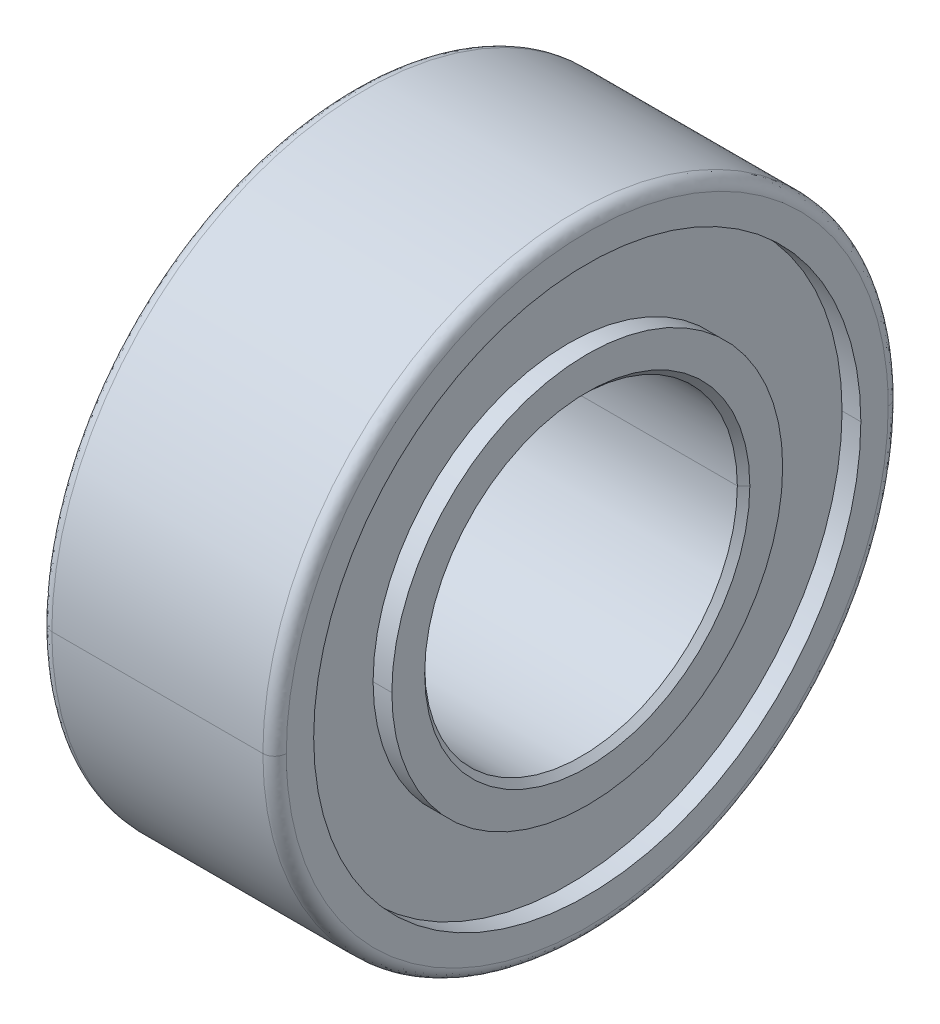
ISO-10303-21;
HEADER;
FILE_DESCRIPTION(('STEP AP214'),'2;1');
FILE_NAME('part.step','',(''),(''),'','','');
FILE_SCHEMA(('AUTOMOTIVE_DESIGN { 1 0 10303 214 1 1 1 1 }'));
ENDSEC;
DATA;
#1=APPLICATION_CONTEXT('core data for automotive mechanical design processes');
#2=APPLICATION_PROTOCOL_DEFINITION('international standard','automotive_design',2000,#1);
#3=PRODUCT_CONTEXT('',#1,'mechanical');
#4=PRODUCT('Part','Part','',(#3));
#5=PRODUCT_RELATED_PRODUCT_CATEGORY('part','',(#4));
#6=PRODUCT_DEFINITION_FORMATION('','',#4);
#7=PRODUCT_DEFINITION_CONTEXT('part definition',#1,'design');
#8=PRODUCT_DEFINITION('design','',#6,#7);
#9=PRODUCT_DEFINITION_SHAPE('','',#8);
#10=(LENGTH_UNIT() NAMED_UNIT(*) SI_UNIT(.MILLI.,.METRE.));
#11=(NAMED_UNIT(*) PLANE_ANGLE_UNIT() SI_UNIT($,.RADIAN.));
#12=(NAMED_UNIT(*) SI_UNIT($,.STERADIAN.) SOLID_ANGLE_UNIT());
#13=UNCERTAINTY_MEASURE_WITH_UNIT(LENGTH_MEASURE(1.E-05),#10,'distance_accuracy_value','');
#14=(GEOMETRIC_REPRESENTATION_CONTEXT(3) GLOBAL_UNCERTAINTY_ASSIGNED_CONTEXT((#13)) GLOBAL_UNIT_ASSIGNED_CONTEXT((#10,
#11,#12)) REPRESENTATION_CONTEXT('',''));
#15=CARTESIAN_POINT('',(0.,0.,0.));
#16=DIRECTION('',(0.,0.,1.));
#17=DIRECTION('',(1.,0.,0.));
#18=AXIS2_PLACEMENT_3D('',#15,#16,#17);
#19=CARTESIAN_POINT('',(0.,0.,0.));
#20=DIRECTION('',(-1.,0.,0.));
#21=DIRECTION('',(0.,0.,1.));
#22=AXIS2_PLACEMENT_3D('',#19,#20,#21);
#23=CYLINDRICAL_SURFACE('',#22,3.175);
#24=DIRECTION('',(-1.,0.,0.));
#25=VECTOR('',#24,1.);
#26=CARTESIAN_POINT('',(0.,0.,-3.175));
#27=LINE('',#26,#25);
#28=CARTESIAN_POINT('',(2.25425000002133,0.,-3.17500000005566));
#29=VERTEX_POINT('',#28);
#30=CARTESIAN_POINT('',(-2.25424999996448,0.,-3.17499999999881));
#31=VERTEX_POINT('',#30);
#32=EDGE_CURVE('E327',#29,#31,#27,.T.);
#33=ORIENTED_EDGE('',*,*,#32,.F.);
#34=CARTESIAN_POINT('',(2.25425000002133,0.,0.));
#35=DIRECTION('',(1.,0.,0.));
#36=DIRECTION('',(0.,0.,-1.));
#37=AXIS2_PLACEMENT_3D('',#34,#35,#36);
#38=CIRCLE('',#37,3.17500000005566);
#39=CARTESIAN_POINT('',(2.25425000002133,0.,3.17500000005566));
#40=VERTEX_POINT('',#39);
#41=EDGE_CURVE('E11',#29,#40,#38,.T.);
#42=ORIENTED_EDGE('',*,*,#41,.T.);
#43=DIRECTION('',(-1.,0.,0.));
#44=VECTOR('',#43,1.);
#45=CARTESIAN_POINT('',(0.,0.,3.175));
#46=LINE('',#45,#44);
#47=CARTESIAN_POINT('',(-2.25424999996448,0.,3.17499999999881));
#48=VERTEX_POINT('',#47);
#49=EDGE_CURVE('E277',#40,#48,#46,.T.);
#50=ORIENTED_EDGE('',*,*,#49,.T.);
#51=CARTESIAN_POINT('',(-2.25424999996448,0.,0.));
#52=DIRECTION('',(-1.,0.,0.));
#53=DIRECTION('',(0.,0.,1.));
#54=AXIS2_PLACEMENT_3D('',#51,#52,#53);
#55=CIRCLE('',#54,3.17499999999881);
#56=EDGE_CURVE('E27',#48,#31,#55,.T.);
#57=ORIENTED_EDGE('',*,*,#56,.T.);
#58=EDGE_LOOP('',(#33,#42,#50,#57));
#59=FACE_BOUND('',#58,.T.);
#60=ADVANCED_FACE('F16',(#59),#23,.F.);
#61=CARTESIAN_POINT('',(2.38125000004174,0.,0.));
#62=DIRECTION('',(1.,0.,0.));
#63=DIRECTION('',(0.,0.,-1.));
#64=AXIS2_PLACEMENT_3D('',#61,#62,#63);
#65=CONICAL_SURFACE('',#64,3.30200000001923,0.785398163173655);
#66=DIRECTION('',(0.707106781344793,0.,0.707106781028302));
#67=VECTOR('',#66,1.);
#68=CARTESIAN_POINT('',(2.38125000004174,0.,3.30200000001923));
#69=LINE('',#68,#67);
#70=CARTESIAN_POINT('',(2.38125000004174,0.,3.30200000001923));
#71=VERTEX_POINT('',#70);
#72=EDGE_CURVE('E322',#40,#71,#69,.T.);
#73=ORIENTED_EDGE('',*,*,#72,.F.);
#74=ORIENTED_EDGE('',*,*,#41,.F.);
#75=DIRECTION('',(0.707106781344793,0.,-0.707106781028302));
#76=VECTOR('',#75,1.);
#77=CARTESIAN_POINT('',(2.38125000004174,0.,-3.30200000001923));
#78=LINE('',#77,#76);
#79=CARTESIAN_POINT('',(2.38125000004174,0.,-3.30200000001923));
#80=VERTEX_POINT('',#79);
#81=EDGE_CURVE('E331',#29,#80,#78,.T.);
#82=ORIENTED_EDGE('',*,*,#81,.T.);
#83=CARTESIAN_POINT('',(2.38125000004174,0.,0.));
#84=DIRECTION('',(1.,0.,0.));
#85=DIRECTION('',(0.,0.,-1.));
#86=AXIS2_PLACEMENT_3D('',#83,#84,#85);
#87=CIRCLE('',#86,3.30200000001923);
#88=EDGE_CURVE('E41',#80,#71,#87,.T.);
#89=ORIENTED_EDGE('',*,*,#88,.T.);
#90=EDGE_LOOP('',(#73,#74,#82,#89));
#91=FACE_BOUND('',#90,.T.);
#92=ADVANCED_FACE('F586',(#91),#65,.F.);
#93=CARTESIAN_POINT('',(-2.38124999992806,0.,0.));
#94=DIRECTION('',(-1.,0.,0.));
#95=DIRECTION('',(0.,0.,1.));
#96=AXIS2_PLACEMENT_3D('',#93,#94,#95);
#97=CONICAL_SURFACE('',#96,3.30199999990554,0.785398163397448);
#98=DIRECTION('',(-0.707106781186548,0.,-0.707106781186548));
#99=VECTOR('',#98,1.);
#100=CARTESIAN_POINT('',(-2.38124999992806,0.,-3.30199999990554));
#101=LINE('',#100,#99);
#102=CARTESIAN_POINT('',(-2.3812499999849,0.,-3.30199999996239));
#103=VERTEX_POINT('',#102);
#104=EDGE_CURVE('E252',#31,#103,#101,.T.);
#105=ORIENTED_EDGE('',*,*,#104,.F.);
#106=ORIENTED_EDGE('',*,*,#56,.F.);
#107=DIRECTION('',(-0.707106781186548,0.,0.707106781186548));
#108=VECTOR('',#107,1.);
#109=CARTESIAN_POINT('',(-2.38124999992806,0.,3.30199999990554));
#110=LINE('',#109,#108);
#111=CARTESIAN_POINT('',(-2.3812499999849,0.,3.30199999996239));
#112=VERTEX_POINT('',#111);
#113=EDGE_CURVE('E287',#48,#112,#110,.T.);
#114=ORIENTED_EDGE('',*,*,#113,.T.);
#115=CARTESIAN_POINT('',(-2.3812499999849,0.,0.));
#116=DIRECTION('',(-1.,0.,0.));
#117=DIRECTION('',(0.,0.,1.));
#118=AXIS2_PLACEMENT_3D('',#115,#116,#117);
#119=CIRCLE('',#118,3.30199999996239);
#120=EDGE_CURVE('E308',#112,#103,#119,.T.);
#121=ORIENTED_EDGE('',*,*,#120,.T.);
#122=EDGE_LOOP('',(#105,#106,#114,#121));
#123=FACE_BOUND('',#122,.T.);
#124=ADVANCED_FACE('F401',(#123),#97,.F.);
#125=CARTESIAN_POINT('',(2.38125,3.175,0.));
#126=DIRECTION('',(-1.,0.,0.));
#127=DIRECTION('',(0.,0.,1.));
#128=AXIS2_PLACEMENT_3D('',#125,#126,#127);
#129=PLANE('',#128);
#130=ORIENTED_EDGE('',*,*,#88,.F.);
#131=CARTESIAN_POINT('',(2.38125000004174,0.,0.));
#132=DIRECTION('',(1.,0.,0.));
#133=DIRECTION('',(0.,0.,-1.));
#134=AXIS2_PLACEMENT_3D('',#131,#132,#133);
#135=CIRCLE('',#134,3.30200000001923);
#136=EDGE_CURVE('E326',#71,#80,#135,.T.);
#137=ORIENTED_EDGE('',*,*,#136,.F.);
#138=EDGE_LOOP('',(#130,#137));
#139=FACE_BOUND('',#138,.T.);
#140=CARTESIAN_POINT('',(2.38125,0.,0.));
#141=DIRECTION('',(-1.,0.,0.));
#142=DIRECTION('',(0.,0.,1.));
#143=AXIS2_PLACEMENT_3D('',#140,#141,#142);
#144=CIRCLE('',#143,3.96875);
#145=CARTESIAN_POINT('',(2.38125,0.,3.96875));
#146=VERTEX_POINT('',#145);
#147=CARTESIAN_POINT('',(2.38125,0.,-3.96875));
#148=VERTEX_POINT('',#147);
#149=EDGE_CURVE('E315',#146,#148,#144,.T.);
#150=ORIENTED_EDGE('',*,*,#149,.F.);
#151=CARTESIAN_POINT('',(2.38125,0.,0.));
#152=DIRECTION('',(-1.,0.,0.));
#153=DIRECTION('',(0.,0.,1.));
#154=AXIS2_PLACEMENT_3D('',#151,#152,#153);
#155=CIRCLE('',#154,3.96875);
#156=EDGE_CURVE('E238',#148,#146,#155,.T.);
#157=ORIENTED_EDGE('',*,*,#156,.F.);
#158=EDGE_LOOP('',(#150,#157));
#159=FACE_BOUND('',#158,.T.);
#160=ADVANCED_FACE('F398',(#139,#159),#129,.F.);
#161=CARTESIAN_POINT('',(-2.38125,3.96875,0.));
#162=DIRECTION('',(1.,0.,0.));
#163=DIRECTION('',(0.,1.,0.));
#164=AXIS2_PLACEMENT_3D('',#161,#162,#163);
#165=PLANE('',#164);
#166=ORIENTED_EDGE('',*,*,#120,.F.);
#167=CARTESIAN_POINT('',(-2.3812499999849,0.,0.));
#168=DIRECTION('',(-1.,0.,0.));
#169=DIRECTION('',(0.,0.,1.));
#170=AXIS2_PLACEMENT_3D('',#167,#168,#169);
#171=CIRCLE('',#170,3.30199999996239);
#172=EDGE_CURVE('E256',#103,#112,#171,.T.);
#173=ORIENTED_EDGE('',*,*,#172,.F.);
#174=EDGE_LOOP('',(#166,#173));
#175=FACE_BOUND('',#174,.T.);
#176=CARTESIAN_POINT('',(-2.38125,0.,0.));
#177=DIRECTION('',(1.,0.,0.));
#178=DIRECTION('',(0.,0.,1.));
#179=AXIS2_PLACEMENT_3D('',#176,#177,#178);
#180=CIRCLE('',#179,3.96875);
#181=CARTESIAN_POINT('',(-2.38125,0.,3.96875));
#182=VERTEX_POINT('',#181);
#183=CARTESIAN_POINT('',(-2.38125,0.,-3.96875));
#184=VERTEX_POINT('',#183);
#185=EDGE_CURVE('E227',#182,#184,#180,.T.);
#186=ORIENTED_EDGE('',*,*,#185,.F.);
#187=CARTESIAN_POINT('',(-2.38125,0.,0.));
#188=DIRECTION('',(1.,0.,0.));
#189=DIRECTION('',(0.,0.,1.));
#190=AXIS2_PLACEMENT_3D('',#187,#188,#189);
#191=CIRCLE('',#190,3.96875);
#192=EDGE_CURVE('E335',#184,#182,#191,.T.);
#193=ORIENTED_EDGE('',*,*,#192,.F.);
#194=EDGE_LOOP('',(#186,#193));
#195=FACE_BOUND('',#194,.T.);
#196=ADVANCED_FACE('F18',(#175,#195),#165,.F.);
#197=CARTESIAN_POINT('',(0.,0.,0.));
#198=DIRECTION('',(-1.,0.,0.));
#199=DIRECTION('',(0.,0.,1.));
#200=AXIS2_PLACEMENT_3D('',#197,#198,#199);
#201=CYLINDRICAL_SURFACE('',#200,3.96875);
#202=DIRECTION('',(-1.,0.,0.));
#203=VECTOR('',#202,1.);
#204=CARTESIAN_POINT('',(0.,0.,-3.96875));
#205=LINE('',#204,#203);
#206=CARTESIAN_POINT('',(2.00025,0.,-3.96875));
#207=VERTEX_POINT('',#206);
#208=EDGE_CURVE('E268',#148,#207,#205,.T.);
#209=ORIENTED_EDGE('',*,*,#208,.F.);
#210=ORIENTED_EDGE('',*,*,#156,.T.);
#211=DIRECTION('',(-1.,0.,0.));
#212=VECTOR('',#211,1.);
#213=CARTESIAN_POINT('',(0.,0.,3.96875));
#214=LINE('',#213,#212);
#215=CARTESIAN_POINT('',(2.00025,0.,3.96875));
#216=VERTEX_POINT('',#215);
#217=EDGE_CURVE('E267',#146,#216,#214,.T.);
#218=ORIENTED_EDGE('',*,*,#217,.T.);
#219=CARTESIAN_POINT('',(2.00025,0.,0.));
#220=DIRECTION('',(1.,0.,0.));
#221=DIRECTION('',(0.,0.,1.));
#222=AXIS2_PLACEMENT_3D('',#219,#220,#221);
#223=CIRCLE('',#222,3.96875);
#224=EDGE_CURVE('E224',#216,#207,#223,.T.);
#225=ORIENTED_EDGE('',*,*,#224,.T.);
#226=EDGE_LOOP('',(#209,#210,#218,#225));
#227=FACE_BOUND('',#226,.T.);
#228=ADVANCED_FACE('F406',(#227),#201,.T.);
#229=CARTESIAN_POINT('',(0.,0.,0.));
#230=DIRECTION('',(-1.,0.,0.));
#231=DIRECTION('',(0.,0.,1.));
#232=AXIS2_PLACEMENT_3D('',#229,#230,#231);
#233=CYLINDRICAL_SURFACE('',#232,3.96875);
#234=DIRECTION('',(-1.,0.,0.));
#235=VECTOR('',#234,1.);
#236=CARTESIAN_POINT('',(0.,0.,-3.96875));
#237=LINE('',#236,#235);
#238=CARTESIAN_POINT('',(-2.00025,0.,-3.96875));
#239=VERTEX_POINT('',#238);
#240=EDGE_CURVE('E215',#239,#184,#237,.T.);
#241=ORIENTED_EDGE('',*,*,#240,.F.);
#242=CARTESIAN_POINT('',(-2.00025,0.,0.));
#243=DIRECTION('',(-1.,0.,0.));
#244=DIRECTION('',(0.,0.,1.));
#245=AXIS2_PLACEMENT_3D('',#242,#243,#244);
#246=CIRCLE('',#245,3.96875);
#247=CARTESIAN_POINT('',(-2.00025,0.,3.96875));
#248=VERTEX_POINT('',#247);
#249=EDGE_CURVE('E228',#239,#248,#246,.T.);
#250=ORIENTED_EDGE('',*,*,#249,.T.);
#251=DIRECTION('',(-1.,0.,0.));
#252=VECTOR('',#251,1.);
#253=CARTESIAN_POINT('',(0.,0.,3.96875));
#254=LINE('',#253,#252);
#255=EDGE_CURVE('E338',#248,#182,#254,.T.);
#256=ORIENTED_EDGE('',*,*,#255,.T.);
#257=ORIENTED_EDGE('',*,*,#185,.T.);
#258=EDGE_LOOP('',(#241,#250,#256,#257));
#259=FACE_BOUND('',#258,.T.);
#260=ADVANCED_FACE('F475',(#259),#233,.T.);
#261=CARTESIAN_POINT('',(2.00025,3.96875,0.));
#262=DIRECTION('',(-1.,0.,0.));
#263=DIRECTION('',(0.,0.,1.));
#264=AXIS2_PLACEMENT_3D('',#261,#262,#263);
#265=PLANE('',#264);
#266=ORIENTED_EDGE('',*,*,#224,.F.);
#267=CARTESIAN_POINT('',(2.00025,0.,0.));
#268=DIRECTION('',(1.,0.,0.));
#269=DIRECTION('',(0.,0.,1.));
#270=AXIS2_PLACEMENT_3D('',#267,#268,#269);
#271=CIRCLE('',#270,3.96875);
#272=EDGE_CURVE('E263',#207,#216,#271,.T.);
#273=ORIENTED_EDGE('',*,*,#272,.F.);
#274=EDGE_LOOP('',(#266,#273));
#275=FACE_BOUND('',#274,.T.);
#276=CARTESIAN_POINT('',(2.00025,0.,0.));
#277=DIRECTION('',(1.,0.,0.));
#278=DIRECTION('',(0.,0.,1.));
#279=AXIS2_PLACEMENT_3D('',#276,#277,#278);
#280=CIRCLE('',#279,5.55625);
#281=CARTESIAN_POINT('',(2.00025,0.,5.55625));
#282=VERTEX_POINT('',#281);
#283=CARTESIAN_POINT('',(2.00025,0.,-5.55625));
#284=VERTEX_POINT('',#283);
#285=EDGE_CURVE('E221',#282,#284,#280,.T.);
#286=ORIENTED_EDGE('',*,*,#285,.T.);
#287=CARTESIAN_POINT('',(2.00025,0.,0.));
#288=DIRECTION('',(1.,0.,0.));
#289=DIRECTION('',(0.,0.,1.));
#290=AXIS2_PLACEMENT_3D('',#287,#288,#289);
#291=CIRCLE('',#290,5.55625);
#292=EDGE_CURVE('E176',#284,#282,#291,.T.);
#293=ORIENTED_EDGE('',*,*,#292,.T.);
#294=EDGE_LOOP('',(#286,#293));
#295=FACE_BOUND('',#294,.T.);
#296=ADVANCED_FACE('F470',(#275,#295),#265,.F.);
#297=CARTESIAN_POINT('',(-2.00025,5.55625,0.));
#298=DIRECTION('',(1.,0.,0.));
#299=DIRECTION('',(0.,1.,0.));
#300=AXIS2_PLACEMENT_3D('',#297,#298,#299);
#301=PLANE('',#300);
#302=CARTESIAN_POINT('',(-2.00025,0.,0.));
#303=DIRECTION('',(-1.,0.,0.));
#304=DIRECTION('',(0.,0.,1.));
#305=AXIS2_PLACEMENT_3D('',#302,#303,#304);
#306=CIRCLE('',#305,3.96875);
#307=EDGE_CURVE('E208',#248,#239,#306,.T.);
#308=ORIENTED_EDGE('',*,*,#307,.F.);
#309=ORIENTED_EDGE('',*,*,#249,.F.);
#310=EDGE_LOOP('',(#308,#309));
#311=FACE_BOUND('',#310,.T.);
#312=CARTESIAN_POINT('',(-2.00025,0.,0.));
#313=DIRECTION('',(-1.,0.,0.));
#314=DIRECTION('',(0.,0.,1.));
#315=AXIS2_PLACEMENT_3D('',#312,#313,#314);
#316=CIRCLE('',#315,5.55625);
#317=CARTESIAN_POINT('',(-2.00025,0.,5.55625));
#318=VERTEX_POINT('',#317);
#319=CARTESIAN_POINT('',(-2.00025,0.,-5.55625));
#320=VERTEX_POINT('',#319);
#321=EDGE_CURVE('E165',#318,#320,#316,.T.);
#322=ORIENTED_EDGE('',*,*,#321,.T.);
#323=CARTESIAN_POINT('',(-2.00025,0.,0.));
#324=DIRECTION('',(-1.,0.,0.));
#325=DIRECTION('',(0.,0.,1.));
#326=AXIS2_PLACEMENT_3D('',#323,#324,#325);
#327=CIRCLE('',#326,5.55625);
#328=EDGE_CURVE('E180',#320,#318,#327,.T.);
#329=ORIENTED_EDGE('',*,*,#328,.T.);
#330=EDGE_LOOP('',(#322,#329));
#331=FACE_BOUND('',#330,.T.);
#332=ADVANCED_FACE('F185',(#311,#331),#301,.F.);
#333=CARTESIAN_POINT('',(0.,0.,0.));
#334=DIRECTION('',(-1.,0.,0.));
#335=DIRECTION('',(0.,0.,1.));
#336=AXIS2_PLACEMENT_3D('',#333,#334,#335);
#337=CYLINDRICAL_SURFACE('',#336,5.55625);
#338=DIRECTION('',(-1.,0.,0.));
#339=VECTOR('',#338,1.);
#340=CARTESIAN_POINT('',(0.,0.,-5.55625));
#341=LINE('',#340,#339);
#342=CARTESIAN_POINT('',(2.38125,0.,-5.55625));
#343=VERTEX_POINT('',#342);
#344=EDGE_CURVE('E217',#343,#284,#341,.T.);
#345=ORIENTED_EDGE('',*,*,#344,.F.);
#346=CARTESIAN_POINT('',(2.38125,0.,0.));
#347=DIRECTION('',(1.,0.,0.));
#348=DIRECTION('',(0.,0.,1.));
#349=AXIS2_PLACEMENT_3D('',#346,#347,#348);
#350=CIRCLE('',#349,5.55625);
#351=CARTESIAN_POINT('',(2.38125,0.,5.55625));
#352=VERTEX_POINT('',#351);
#353=EDGE_CURVE('E130',#343,#352,#350,.T.);
#354=ORIENTED_EDGE('',*,*,#353,.T.);
#355=DIRECTION('',(-1.,0.,0.));
#356=VECTOR('',#355,1.);
#357=CARTESIAN_POINT('',(0.,0.,5.55625));
#358=LINE('',#357,#356);
#359=EDGE_CURVE('E216',#352,#282,#358,.T.);
#360=ORIENTED_EDGE('',*,*,#359,.T.);
#361=ORIENTED_EDGE('',*,*,#292,.F.);
#362=EDGE_LOOP('',(#345,#354,#360,#361));
#363=FACE_BOUND('',#362,.T.);
#364=ADVANCED_FACE('F508',(#363),#337,.F.);
#365=CARTESIAN_POINT('',(0.,0.,0.));
#366=DIRECTION('',(-1.,0.,0.));
#367=DIRECTION('',(0.,0.,1.));
#368=AXIS2_PLACEMENT_3D('',#365,#366,#367);
#369=CYLINDRICAL_SURFACE('',#368,5.55625);
#370=DIRECTION('',(-1.,0.,0.));
#371=VECTOR('',#370,1.);
#372=CARTESIAN_POINT('',(0.,0.,-5.55625));
#373=LINE('',#372,#371);
#374=CARTESIAN_POINT('',(-2.38125,0.,-5.55625));
#375=VERTEX_POINT('',#374);
#376=EDGE_CURVE('E171',#320,#375,#373,.T.);
#377=ORIENTED_EDGE('',*,*,#376,.F.);
#378=ORIENTED_EDGE('',*,*,#321,.F.);
#379=DIRECTION('',(-1.,0.,0.));
#380=VECTOR('',#379,1.);
#381=CARTESIAN_POINT('',(0.,0.,5.55625));
#382=LINE('',#381,#380);
#383=CARTESIAN_POINT('',(-2.38125,0.,5.55625));
#384=VERTEX_POINT('',#383);
#385=EDGE_CURVE('E168',#318,#384,#382,.T.);
#386=ORIENTED_EDGE('',*,*,#385,.T.);
#387=CARTESIAN_POINT('',(-2.38125,0.,0.));
#388=DIRECTION('',(-1.,0.,0.));
#389=DIRECTION('',(0.,0.,1.));
#390=AXIS2_PLACEMENT_3D('',#387,#388,#389);
#391=CIRCLE('',#390,5.55625);
#392=EDGE_CURVE('E117',#384,#375,#391,.T.);
#393=ORIENTED_EDGE('',*,*,#392,.T.);
#394=EDGE_LOOP('',(#377,#378,#386,#393));
#395=FACE_BOUND('',#394,.T.);
#396=ADVANCED_FACE('F167',(#395),#369,.F.);
#397=CARTESIAN_POINT('',(2.38125,5.55625,0.));
#398=DIRECTION('',(-1.,0.,0.));
#399=DIRECTION('',(0.,0.,1.));
#400=AXIS2_PLACEMENT_3D('',#397,#398,#399);
#401=PLANE('',#400);
#402=CARTESIAN_POINT('',(2.38125,0.,0.));
#403=DIRECTION('',(1.,0.,0.));
#404=DIRECTION('',(0.,0.,1.));
#405=AXIS2_PLACEMENT_3D('',#402,#403,#404);
#406=CIRCLE('',#405,5.55625);
#407=EDGE_CURVE('E183',#352,#343,#406,.T.);
#408=ORIENTED_EDGE('',*,*,#407,.F.);
#409=ORIENTED_EDGE('',*,*,#353,.F.);
#410=EDGE_LOOP('',(#408,#409));
#411=FACE_BOUND('',#410,.T.);
#412=CARTESIAN_POINT('',(2.38125,0.,6.111875));
#413=CARTESIAN_POINT('',(2.38125,12.22375,6.11187499999999));
#414=CARTESIAN_POINT('',(2.38125,12.22375,-6.11187499999999));
#415=CARTESIAN_POINT('',(2.38125,0.,-6.111875));
#416=(BOUNDED_CURVE() B_SPLINE_CURVE(3,(#412,#413,#414,#415),.UNSPECIFIED.,.F.,
.F.) B_SPLINE_CURVE_WITH_KNOTS((4,4),(0.,1.),
.UNSPECIFIED.) CURVE() GEOMETRIC_REPRESENTATION_ITEM() RATIONAL_B_SPLINE_CURVE((1.,
0.333333333333334,0.333333333333334,1.)) REPRESENTATION_ITEM(''));
#417=CARTESIAN_POINT('',(2.38125,0.,6.111875));
#418=VERTEX_POINT('',#417);
#419=CARTESIAN_POINT('',(2.38125,0.,-6.111875));
#420=VERTEX_POINT('',#419);
#421=EDGE_CURVE('E89',#418,#420,#416,.T.);
#422=ORIENTED_EDGE('',*,*,#421,.F.);
#423=CARTESIAN_POINT('',(2.38125,0.,-6.111875));
#424=CARTESIAN_POINT('',(2.38125,-12.22375,-6.11187499999999));
#425=CARTESIAN_POINT('',(2.38125,-12.22375,6.11187499999999));
#426=CARTESIAN_POINT('',(2.38125,0.,6.111875));
#427=(BOUNDED_CURVE() B_SPLINE_CURVE(3,(#423,#424,#425,#426),.UNSPECIFIED.,.F.,
.F.) B_SPLINE_CURVE_WITH_KNOTS((4,4),(0.,1.),
.UNSPECIFIED.) CURVE() GEOMETRIC_REPRESENTATION_ITEM() RATIONAL_B_SPLINE_CURVE((1.,
0.333333333333334,0.333333333333334,1.)) REPRESENTATION_ITEM(''));
#428=EDGE_CURVE('E262',#420,#418,#427,.T.);
#429=ORIENTED_EDGE('',*,*,#428,.F.);
#430=EDGE_LOOP('',(#422,#429));
#431=FACE_BOUND('',#430,.T.);
#432=ADVANCED_FACE('F484',(#411,#431),#401,.F.);
#433=CARTESIAN_POINT('',(-2.38125,6.35,0.));
#434=DIRECTION('',(1.,0.,0.));
#435=DIRECTION('',(0.,1.,0.));
#436=AXIS2_PLACEMENT_3D('',#433,#434,#435);
#437=PLANE('',#436);
#438=ORIENTED_EDGE('',*,*,#392,.F.);
#439=CARTESIAN_POINT('',(-2.38125,0.,0.));
#440=DIRECTION('',(-1.,0.,0.));
#441=DIRECTION('',(0.,0.,1.));
#442=AXIS2_PLACEMENT_3D('',#439,#440,#441);
#443=CIRCLE('',#442,5.55625);
#444=EDGE_CURVE('E181',#375,#384,#443,.T.);
#445=ORIENTED_EDGE('',*,*,#444,.F.);
#446=EDGE_LOOP('',(#438,#445));
#447=FACE_BOUND('',#446,.T.);
#448=CARTESIAN_POINT('',(-2.38125,0.,-6.111875));
#449=CARTESIAN_POINT('',(-2.38125,12.22375,-6.11187499999999));
#450=CARTESIAN_POINT('',(-2.38125,12.22375,6.11187499999999));
#451=CARTESIAN_POINT('',(-2.38125,0.,6.111875));
#452=(BOUNDED_CURVE() B_SPLINE_CURVE(3,(#448,#449,#450,#451),.UNSPECIFIED.,.F.,
.F.) B_SPLINE_CURVE_WITH_KNOTS((4,4),(0.,1.),
.UNSPECIFIED.) CURVE() GEOMETRIC_REPRESENTATION_ITEM() RATIONAL_B_SPLINE_CURVE((1.,
0.333333333333334,0.333333333333334,1.)) REPRESENTATION_ITEM(''));
#453=CARTESIAN_POINT('',(-2.38125,0.,-6.111875));
#454=VERTEX_POINT('',#453);
#455=CARTESIAN_POINT('',(-2.38125,0.,6.111875));
#456=VERTEX_POINT('',#455);
#457=EDGE_CURVE('E271',#454,#456,#452,.T.);
#458=ORIENTED_EDGE('',*,*,#457,.F.);
#459=CARTESIAN_POINT('',(-2.38125,0.,6.111875));
#460=CARTESIAN_POINT('',(-2.38125,-12.22375,6.11187499999999));
#461=CARTESIAN_POINT('',(-2.38125,-12.22375,-6.11187499999999));
#462=CARTESIAN_POINT('',(-2.38125,0.,-6.111875));
#463=(BOUNDED_CURVE() B_SPLINE_CURVE(3,(#459,#460,#461,#462),.UNSPECIFIED.,.F.,
.F.) B_SPLINE_CURVE_WITH_KNOTS((4,4),(0.,1.),
.UNSPECIFIED.) CURVE() GEOMETRIC_REPRESENTATION_ITEM() RATIONAL_B_SPLINE_CURVE((1.,
0.333333333333334,0.333333333333334,1.)) REPRESENTATION_ITEM(''));
#464=EDGE_CURVE('E200',#456,#454,#463,.T.);
#465=ORIENTED_EDGE('',*,*,#464,.F.);
#466=EDGE_LOOP('',(#458,#465));
#467=FACE_BOUND('',#466,.T.);
#468=ADVANCED_FACE('F489',(#447,#467),#437,.F.);
#469=CARTESIAN_POINT('',(2.143125,0.,6.35));
#470=CARTESIAN_POINT('',(2.143125,12.7,6.34999999999999));
#471=CARTESIAN_POINT('',(2.143125,12.7,-6.34999999999999));
#472=CARTESIAN_POINT('',(2.143125,0.,-6.35));
#473=CARTESIAN_POINT('',(2.28261539545991,0.,6.35));
#474=CARTESIAN_POINT('',(2.28261539545991,12.7,6.34999999999999));
#475=CARTESIAN_POINT('',(2.28261539545991,12.7,-6.34999999999999));
#476=CARTESIAN_POINT('',(2.28261539545991,0.,-6.35));
#477=CARTESIAN_POINT('',(2.38125,0.,6.25136539545991));
#478=CARTESIAN_POINT('',(2.38125,12.5027307909198,6.25136539545991));
#479=CARTESIAN_POINT('',(2.38125,12.5027307909198,-6.25136539545989));
#480=CARTESIAN_POINT('',(2.38125,0.,-6.25136539545991));
#481=CARTESIAN_POINT('',(2.38125,0.,6.111875));
#482=CARTESIAN_POINT('',(2.38125,12.22375,6.11187499999999));
#483=CARTESIAN_POINT('',(2.38125,12.22375,-6.11187499999999));
#484=CARTESIAN_POINT('',(2.38125,0.,-6.111875));
#485=(BOUNDED_SURFACE() B_SPLINE_SURFACE(3,3,((#469,#470,#471,#472),(#473,#474,#475,#476),(#477,
#478,#479,#480),(#481,#482,#483,#484)),.UNSPECIFIED.,.F.,.F.,
.F.) B_SPLINE_SURFACE_WITH_KNOTS((4,4),(4,4),(0.,1.),(0.,1.),
.UNSPECIFIED.) GEOMETRIC_REPRESENTATION_ITEM() RATIONAL_B_SPLINE_SURFACE(((1.,0.333333333333334,
0.333333333333334,1.),(0.804737854124365,0.268245951374788,0.268245951374788,0.804737854124365),
(0.804737854124365,0.268245951374788,0.268245951374788,0.804737854124365),(1.,0.333333333333334,
0.333333333333334,1.))) REPRESENTATION_ITEM('') SURFACE());
#486=CARTESIAN_POINT('',(2.143125,0.,-6.111875));
#487=DIRECTION('',(0.,-1.,0.));
#488=DIRECTION('',(0.,0.,-1.));
#489=AXIS2_PLACEMENT_3D('',#486,#487,#488);
#490=CIRCLE('',#489,0.238125);
#491=CARTESIAN_POINT('',(2.143125,0.,-6.35));
#492=VERTEX_POINT('',#491);
#493=EDGE_CURVE('E286',#492,#420,#490,.T.);
#494=CARTESIAN_POINT('',(2.143125,0.,0.));
#495=DIRECTION('',(-1.,0.,0.));
#496=DIRECTION('',(0.,0.,1.));
#497=AXIS2_PLACEMENT_3D('',#494,#495,#496);
#498=CIRCLE('',#497,6.35);
#499=CARTESIAN_POINT('',(2.143125,0.,6.35));
#500=VERTEX_POINT('',#499);
#501=EDGE_CURVE('E261',#500,#492,#498,.T.);
#502=CARTESIAN_POINT('',(2.143125,0.,6.111875));
#503=DIRECTION('',(0.,1.,0.));
#504=DIRECTION('',(0.,0.,1.));
#505=AXIS2_PLACEMENT_3D('',#502,#503,#504);
#506=CIRCLE('',#505,0.238125);
#507=EDGE_CURVE('E258',#500,#418,#506,.T.);
#508=ORIENTED_EDGE('',*,*,#493,.F.);
#509=ORIENTED_EDGE('',*,*,#501,.F.);
#510=ORIENTED_EDGE('',*,*,#507,.T.);
#511=ORIENTED_EDGE('',*,*,#421,.T.);
#512=EDGE_LOOP('',(#508,#509,#510,#511));
#513=FACE_BOUND('',#512,.T.);
#514=ADVANCED_FACE('F608',(#513),#485,.T.);
#515=CARTESIAN_POINT('',(-2.143125,0.,-6.35));
#516=CARTESIAN_POINT('',(-2.143125,12.7,-6.34999999999999));
#517=CARTESIAN_POINT('',(-2.143125,12.7,6.34999999999999));
#518=CARTESIAN_POINT('',(-2.143125,0.,6.35));
#519=CARTESIAN_POINT('',(-2.2826153954599,0.,-6.35));
#520=CARTESIAN_POINT('',(-2.2826153954599,12.7,-6.34999999999999));
#521=CARTESIAN_POINT('',(-2.2826153954599,12.7,6.34999999999999));
#522=CARTESIAN_POINT('',(-2.2826153954599,0.,6.35));
#523=CARTESIAN_POINT('',(-2.38124999999999,0.,-6.25136539545991));
#524=CARTESIAN_POINT('',(-2.38125,12.5027307909198,-6.25136539545991));
#525=CARTESIAN_POINT('',(-2.38125,12.5027307909198,6.25136539545989));
#526=CARTESIAN_POINT('',(-2.38124999999999,0.,6.25136539545991));
#527=CARTESIAN_POINT('',(-2.38125,0.,-6.111875));
#528=CARTESIAN_POINT('',(-2.38125,12.22375,-6.11187499999999));
#529=CARTESIAN_POINT('',(-2.38125,12.22375,6.11187499999999));
#530=CARTESIAN_POINT('',(-2.38125,0.,6.111875));
#531=(BOUNDED_SURFACE() B_SPLINE_SURFACE(3,3,((#515,#516,#517,#518),(#519,#520,#521,#522),(#523,
#524,#525,#526),(#527,#528,#529,#530)),.UNSPECIFIED.,.F.,.F.,
.F.) B_SPLINE_SURFACE_WITH_KNOTS((4,4),(4,4),(0.,1.),(0.,1.),
.UNSPECIFIED.) GEOMETRIC_REPRESENTATION_ITEM() RATIONAL_B_SPLINE_SURFACE(((1.,0.333333333333334,
0.333333333333334,1.),(0.804737854124365,0.268245951374788,0.268245951374788,0.804737854124365),
(0.804737854124365,0.268245951374788,0.268245951374788,0.804737854124365),(1.,0.333333333333334,
0.333333333333334,1.))) REPRESENTATION_ITEM('') SURFACE());
#532=CARTESIAN_POINT('',(-2.143125,0.,6.111875));
#533=DIRECTION('',(0.,-1.,0.));
#534=DIRECTION('',(0.,0.,1.));
#535=AXIS2_PLACEMENT_3D('',#532,#533,#534);
#536=CIRCLE('',#535,0.238125);
#537=CARTESIAN_POINT('',(-2.143125,0.,6.35));
#538=VERTEX_POINT('',#537);
#539=EDGE_CURVE('E207',#538,#456,#536,.T.);
#540=CARTESIAN_POINT('',(-2.143125,0.,0.));
#541=DIRECTION('',(1.,0.,0.));
#542=DIRECTION('',(0.,0.,1.));
#543=AXIS2_PLACEMENT_3D('',#540,#541,#542);
#544=CIRCLE('',#543,6.35);
#545=CARTESIAN_POINT('',(-2.143125,0.,-6.35));
#546=VERTEX_POINT('',#545);
#547=EDGE_CURVE('E196',#546,#538,#544,.T.);
#548=CARTESIAN_POINT('',(-2.143125,0.,-6.111875));
#549=DIRECTION('',(0.,1.,0.));
#550=DIRECTION('',(0.,0.,-1.));
#551=AXIS2_PLACEMENT_3D('',#548,#549,#550);
#552=CIRCLE('',#551,0.238125);
#553=EDGE_CURVE('E206',#546,#454,#552,.T.);
#554=ORIENTED_EDGE('',*,*,#539,.F.);
#555=ORIENTED_EDGE('',*,*,#547,.F.);
#556=ORIENTED_EDGE('',*,*,#553,.T.);
#557=ORIENTED_EDGE('',*,*,#457,.T.);
#558=EDGE_LOOP('',(#554,#555,#556,#557));
#559=FACE_BOUND('',#558,.T.);
#560=ADVANCED_FACE('F627',(#559),#531,.T.);
#561=CARTESIAN_POINT('',(0.,0.,0.));
#562=DIRECTION('',(-1.,0.,0.));
#563=DIRECTION('',(0.,0.,1.));
#564=AXIS2_PLACEMENT_3D('',#561,#562,#563);
#565=CYLINDRICAL_SURFACE('',#564,6.35);
#566=DIRECTION('',(-1.,0.,0.));
#567=VECTOR('',#566,1.);
#568=CARTESIAN_POINT('',(0.,0.,-6.35));
#569=LINE('',#568,#567);
#570=EDGE_CURVE('E321',#492,#546,#569,.T.);
#571=ORIENTED_EDGE('',*,*,#570,.F.);
#572=CARTESIAN_POINT('',(2.143125,0.,0.));
#573=DIRECTION('',(-1.,0.,0.));
#574=DIRECTION('',(0.,0.,1.));
#575=AXIS2_PLACEMENT_3D('',#572,#573,#574);
#576=CIRCLE('',#575,6.35);
#577=EDGE_CURVE('E303',#492,#500,#576,.T.);
#578=ORIENTED_EDGE('',*,*,#577,.T.);
#579=DIRECTION('',(-1.,0.,0.));
#580=VECTOR('',#579,1.);
#581=CARTESIAN_POINT('',(0.,0.,6.35));
#582=LINE('',#581,#580);
#583=EDGE_CURVE('E187',#500,#538,#582,.T.);
#584=ORIENTED_EDGE('',*,*,#583,.T.);
#585=CARTESIAN_POINT('',(-2.143125,0.,0.));
#586=DIRECTION('',(1.,0.,0.));
#587=DIRECTION('',(0.,0.,1.));
#588=AXIS2_PLACEMENT_3D('',#585,#586,#587);
#589=CIRCLE('',#588,6.35);
#590=EDGE_CURVE('E20',#538,#546,#589,.T.);
#591=ORIENTED_EDGE('',*,*,#590,.T.);
#592=EDGE_LOOP('',(#571,#578,#584,#591));
#593=FACE_BOUND('',#592,.T.);
#594=ADVANCED_FACE('F632',(#593),#565,.T.);
#595=CARTESIAN_POINT('',(0.,0.,0.));
#596=DIRECTION('',(-1.,0.,0.));
#597=DIRECTION('',(0.,0.,1.));
#598=AXIS2_PLACEMENT_3D('',#595,#596,#597);
#599=CYLINDRICAL_SURFACE('',#598,3.175);
#600=CARTESIAN_POINT('',(2.25425000002133,0.,0.));
#601=DIRECTION('',(1.,0.,0.));
#602=DIRECTION('',(0.,0.,-1.));
#603=AXIS2_PLACEMENT_3D('',#600,#601,#602);
#604=CIRCLE('',#603,3.17500000005566);
#605=EDGE_CURVE('E294',#40,#29,#604,.T.);
#606=ORIENTED_EDGE('',*,*,#605,.T.);
#607=ORIENTED_EDGE('',*,*,#32,.T.);
#608=CARTESIAN_POINT('',(-2.25424999996448,0.,0.));
#609=DIRECTION('',(-1.,0.,0.));
#610=DIRECTION('',(0.,0.,1.));
#611=AXIS2_PLACEMENT_3D('',#608,#609,#610);
#612=CIRCLE('',#611,3.17499999999881);
#613=EDGE_CURVE('E257',#31,#48,#612,.T.);
#614=ORIENTED_EDGE('',*,*,#613,.T.);
#615=ORIENTED_EDGE('',*,*,#49,.F.);
#616=EDGE_LOOP('',(#606,#607,#614,#615));
#617=FACE_BOUND('',#616,.T.);
#618=ADVANCED_FACE('F619',(#617),#599,.F.);
#619=CARTESIAN_POINT('',(2.38125000004174,0.,0.));
#620=DIRECTION('',(1.,0.,0.));
#621=DIRECTION('',(0.,0.,-1.));
#622=AXIS2_PLACEMENT_3D('',#619,#620,#621);
#623=CONICAL_SURFACE('',#622,3.30200000001923,0.785398163173655);
#624=ORIENTED_EDGE('',*,*,#605,.F.);
#625=ORIENTED_EDGE('',*,*,#72,.T.);
#626=ORIENTED_EDGE('',*,*,#136,.T.);
#627=ORIENTED_EDGE('',*,*,#81,.F.);
#628=EDGE_LOOP('',(#624,#625,#626,#627));
#629=FACE_BOUND('',#628,.T.);
#630=ADVANCED_FACE('F396',(#629),#623,.F.);
#631=CARTESIAN_POINT('',(-2.38124999992806,0.,0.));
#632=DIRECTION('',(-1.,0.,0.));
#633=DIRECTION('',(0.,0.,1.));
#634=AXIS2_PLACEMENT_3D('',#631,#632,#633);
#635=CONICAL_SURFACE('',#634,3.30199999990554,0.785398163397448);
#636=ORIENTED_EDGE('',*,*,#613,.F.);
#637=ORIENTED_EDGE('',*,*,#104,.T.);
#638=ORIENTED_EDGE('',*,*,#172,.T.);
#639=ORIENTED_EDGE('',*,*,#113,.F.);
#640=EDGE_LOOP('',(#636,#637,#638,#639));
#641=FACE_BOUND('',#640,.T.);
#642=ADVANCED_FACE('F533',(#641),#635,.F.);
#643=CARTESIAN_POINT('',(0.,0.,0.));
#644=DIRECTION('',(-1.,0.,0.));
#645=DIRECTION('',(0.,0.,1.));
#646=AXIS2_PLACEMENT_3D('',#643,#644,#645);
#647=CYLINDRICAL_SURFACE('',#646,3.96875);
#648=ORIENTED_EDGE('',*,*,#149,.T.);
#649=ORIENTED_EDGE('',*,*,#208,.T.);
#650=ORIENTED_EDGE('',*,*,#272,.T.);
#651=ORIENTED_EDGE('',*,*,#217,.F.);
#652=EDGE_LOOP('',(#648,#649,#650,#651));
#653=FACE_BOUND('',#652,.T.);
#654=ADVANCED_FACE('F405',(#653),#647,.T.);
#655=CARTESIAN_POINT('',(0.,0.,0.));
#656=DIRECTION('',(-1.,0.,0.));
#657=DIRECTION('',(0.,0.,1.));
#658=AXIS2_PLACEMENT_3D('',#655,#656,#657);
#659=CYLINDRICAL_SURFACE('',#658,3.96875);
#660=ORIENTED_EDGE('',*,*,#307,.T.);
#661=ORIENTED_EDGE('',*,*,#240,.T.);
#662=ORIENTED_EDGE('',*,*,#192,.T.);
#663=ORIENTED_EDGE('',*,*,#255,.F.);
#664=EDGE_LOOP('',(#660,#661,#662,#663));
#665=FACE_BOUND('',#664,.T.);
#666=ADVANCED_FACE('F556',(#665),#659,.T.);
#667=CARTESIAN_POINT('',(0.,0.,0.));
#668=DIRECTION('',(-1.,0.,0.));
#669=DIRECTION('',(0.,0.,1.));
#670=AXIS2_PLACEMENT_3D('',#667,#668,#669);
#671=CYLINDRICAL_SURFACE('',#670,5.55625);
#672=ORIENTED_EDGE('',*,*,#407,.T.);
#673=ORIENTED_EDGE('',*,*,#344,.T.);
#674=ORIENTED_EDGE('',*,*,#285,.F.);
#675=ORIENTED_EDGE('',*,*,#359,.F.);
#676=EDGE_LOOP('',(#672,#673,#674,#675));
#677=FACE_BOUND('',#676,.T.);
#678=ADVANCED_FACE('F524',(#677),#671,.F.);
#679=CARTESIAN_POINT('',(0.,0.,0.));
#680=DIRECTION('',(-1.,0.,0.));
#681=DIRECTION('',(0.,0.,1.));
#682=AXIS2_PLACEMENT_3D('',#679,#680,#681);
#683=CYLINDRICAL_SURFACE('',#682,5.55625);
#684=ORIENTED_EDGE('',*,*,#328,.F.);
#685=ORIENTED_EDGE('',*,*,#376,.T.);
#686=ORIENTED_EDGE('',*,*,#444,.T.);
#687=ORIENTED_EDGE('',*,*,#385,.F.);
#688=EDGE_LOOP('',(#684,#685,#686,#687));
#689=FACE_BOUND('',#688,.T.);
#690=ADVANCED_FACE('F179',(#689),#683,.F.);
#691=CARTESIAN_POINT('',(0.,0.,0.));
#692=DIRECTION('',(-1.,0.,0.));
#693=DIRECTION('',(0.,0.,1.));
#694=AXIS2_PLACEMENT_3D('',#691,#692,#693);
#695=CYLINDRICAL_SURFACE('',#694,6.35);
#696=ORIENTED_EDGE('',*,*,#501,.T.);
#697=ORIENTED_EDGE('',*,*,#570,.T.);
#698=ORIENTED_EDGE('',*,*,#547,.T.);
#699=ORIENTED_EDGE('',*,*,#583,.F.);
#700=EDGE_LOOP('',(#696,#697,#698,#699));
#701=FACE_BOUND('',#700,.T.);
#702=ADVANCED_FACE('F523',(#701),#695,.T.);
#703=CARTESIAN_POINT('',(2.143125,0.,-6.35));
#704=CARTESIAN_POINT('',(2.143125,-12.7,-6.34999999999999));
#705=CARTESIAN_POINT('',(2.143125,-12.7,6.34999999999999));
#706=CARTESIAN_POINT('',(2.143125,0.,6.35));
#707=CARTESIAN_POINT('',(2.28261539545991,0.,-6.35));
#708=CARTESIAN_POINT('',(2.28261539545991,-12.7,-6.34999999999999));
#709=CARTESIAN_POINT('',(2.28261539545991,-12.7,6.34999999999999));
#710=CARTESIAN_POINT('',(2.28261539545991,0.,6.35));
#711=CARTESIAN_POINT('',(2.38125,0.,-6.25136539545991));
#712=CARTESIAN_POINT('',(2.38125,-12.5027307909198,-6.25136539545991));
#713=CARTESIAN_POINT('',(2.38125,-12.5027307909198,6.25136539545989));
#714=CARTESIAN_POINT('',(2.38125,0.,6.25136539545991));
#715=CARTESIAN_POINT('',(2.38125,0.,-6.111875));
#716=CARTESIAN_POINT('',(2.38125,-12.22375,-6.11187499999999));
#717=CARTESIAN_POINT('',(2.38125,-12.22375,6.11187499999999));
#718=CARTESIAN_POINT('',(2.38125,0.,6.111875));
#719=(BOUNDED_SURFACE() B_SPLINE_SURFACE(3,3,((#703,#704,#705,#706),(#707,#708,#709,#710),(#711,
#712,#713,#714),(#715,#716,#717,#718)),.UNSPECIFIED.,.F.,.F.,
.F.) B_SPLINE_SURFACE_WITH_KNOTS((4,4),(4,4),(0.,1.),(0.,1.),
.UNSPECIFIED.) GEOMETRIC_REPRESENTATION_ITEM() RATIONAL_B_SPLINE_SURFACE(((1.,0.333333333333334,
0.333333333333334,1.),(0.804737854124365,0.268245951374788,0.268245951374788,0.804737854124365),
(0.804737854124365,0.268245951374788,0.268245951374788,0.804737854124365),(1.,0.333333333333334,
0.333333333333334,1.))) REPRESENTATION_ITEM('') SURFACE());
#720=ORIENTED_EDGE('',*,*,#577,.F.);
#721=ORIENTED_EDGE('',*,*,#493,.T.);
#722=ORIENTED_EDGE('',*,*,#428,.T.);
#723=ORIENTED_EDGE('',*,*,#507,.F.);
#724=EDGE_LOOP('',(#720,#721,#722,#723));
#725=FACE_BOUND('',#724,.T.);
#726=ADVANCED_FACE('F568',(#725),#719,.T.);
#727=CARTESIAN_POINT('',(-2.143125,0.,6.35));
#728=CARTESIAN_POINT('',(-2.143125,-12.7,6.34999999999999));
#729=CARTESIAN_POINT('',(-2.143125,-12.7,-6.34999999999999));
#730=CARTESIAN_POINT('',(-2.143125,0.,-6.35));
#731=CARTESIAN_POINT('',(-2.2826153954599,0.,6.35));
#732=CARTESIAN_POINT('',(-2.2826153954599,-12.7,6.34999999999999));
#733=CARTESIAN_POINT('',(-2.2826153954599,-12.7,-6.34999999999999));
#734=CARTESIAN_POINT('',(-2.2826153954599,0.,-6.35));
#735=CARTESIAN_POINT('',(-2.38124999999999,0.,6.25136539545991));
#736=CARTESIAN_POINT('',(-2.38125,-12.5027307909198,6.25136539545991));
#737=CARTESIAN_POINT('',(-2.38125,-12.5027307909198,-6.25136539545989));
#738=CARTESIAN_POINT('',(-2.38124999999999,0.,-6.25136539545991));
#739=CARTESIAN_POINT('',(-2.38125,0.,6.111875));
#740=CARTESIAN_POINT('',(-2.38125,-12.22375,6.11187499999999));
#741=CARTESIAN_POINT('',(-2.38125,-12.22375,-6.11187499999999));
#742=CARTESIAN_POINT('',(-2.38125,0.,-6.111875));
#743=(BOUNDED_SURFACE() B_SPLINE_SURFACE(3,3,((#727,#728,#729,#730),(#731,#732,#733,#734),(#735,
#736,#737,#738),(#739,#740,#741,#742)),.UNSPECIFIED.,.F.,.F.,
.F.) B_SPLINE_SURFACE_WITH_KNOTS((4,4),(4,4),(0.,1.),(0.,1.),
.UNSPECIFIED.) GEOMETRIC_REPRESENTATION_ITEM() RATIONAL_B_SPLINE_SURFACE(((1.,0.333333333333334,
0.333333333333334,1.),(0.804737854124365,0.268245951374788,0.268245951374788,0.804737854124365),
(0.804737854124365,0.268245951374788,0.268245951374788,0.804737854124365),(1.,0.333333333333334,
0.333333333333334,1.))) REPRESENTATION_ITEM('') SURFACE());
#744=ORIENTED_EDGE('',*,*,#590,.F.);
#745=ORIENTED_EDGE('',*,*,#539,.T.);
#746=ORIENTED_EDGE('',*,*,#464,.T.);
#747=ORIENTED_EDGE('',*,*,#553,.F.);
#748=EDGE_LOOP('',(#744,#745,#746,#747));
#749=FACE_BOUND('',#748,.T.);
#750=ADVANCED_FACE('F573',(#749),#743,.T.);
#751=CLOSED_SHELL('',(#60,#92,#124,#160,#196,#228,#260,#296,#332,#364,#396,#432,#468,#514,#560,
#594,#618,#630,#642,#654,#666,#678,#690,#702,#726,#750));
#752=MANIFOLD_SOLID_BREP('B1',#751);
#753=ADVANCED_BREP_SHAPE_REPRESENTATION('',(#18,#752),#14);
#754=SHAPE_DEFINITION_REPRESENTATION(#9,#753);
ENDSEC;
END-ISO-10303-21;
